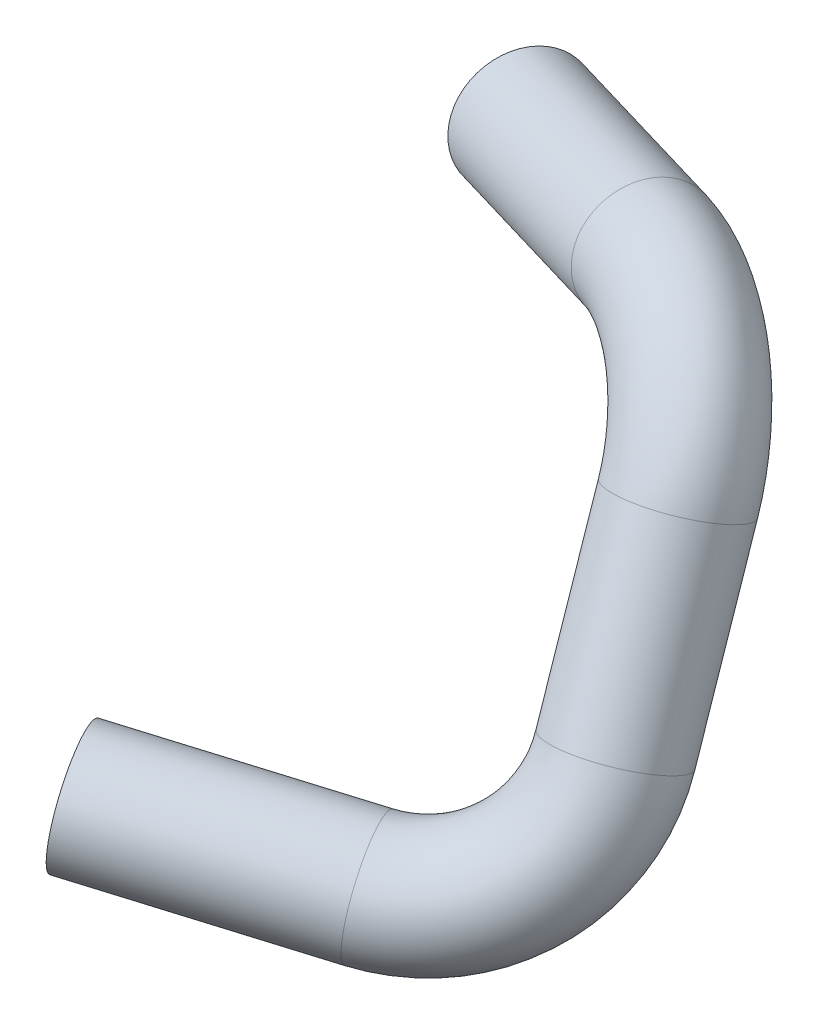
ISO-10303-21;
HEADER;
FILE_DESCRIPTION(('STEP AP214'),'2;1');
FILE_NAME('part.step','',(''),(''),'','','');
FILE_SCHEMA(('AUTOMOTIVE_DESIGN { 1 0 10303 214 1 1 1 1 }'));
ENDSEC;
DATA;
#1=APPLICATION_CONTEXT('core data for automotive mechanical design processes');
#2=APPLICATION_PROTOCOL_DEFINITION('international standard','automotive_design',2000,#1);
#3=PRODUCT_CONTEXT('',#1,'mechanical');
#4=PRODUCT('Part','Part','',(#3));
#5=PRODUCT_RELATED_PRODUCT_CATEGORY('part','',(#4));
#6=PRODUCT_DEFINITION_FORMATION('','',#4);
#7=PRODUCT_DEFINITION_CONTEXT('part definition',#1,'design');
#8=PRODUCT_DEFINITION('design','',#6,#7);
#9=PRODUCT_DEFINITION_SHAPE('','',#8);
#10=(LENGTH_UNIT() NAMED_UNIT(*) SI_UNIT(.MILLI.,.METRE.));
#11=(NAMED_UNIT(*) PLANE_ANGLE_UNIT() SI_UNIT($,.RADIAN.));
#12=(NAMED_UNIT(*) SI_UNIT($,.STERADIAN.) SOLID_ANGLE_UNIT());
#13=UNCERTAINTY_MEASURE_WITH_UNIT(LENGTH_MEASURE(1.E-05),#10,'distance_accuracy_value','');
#14=(GEOMETRIC_REPRESENTATION_CONTEXT(3) GLOBAL_UNCERTAINTY_ASSIGNED_CONTEXT((#13)) GLOBAL_UNIT_ASSIGNED_CONTEXT((#10,
#11,#12)) REPRESENTATION_CONTEXT('',''));
#15=CARTESIAN_POINT('',(0.,0.,0.));
#16=DIRECTION('',(0.,0.,1.));
#17=DIRECTION('',(1.,0.,0.));
#18=AXIS2_PLACEMENT_3D('',#15,#16,#17);
#19=CARTESIAN_POINT('',(-26.8654624841385,-1.31957880510115,27.3592431742286));
#20=DIRECTION('',(-0.884530547258439,0.135752757613117,0.446292392683453));
#21=DIRECTION('',(-0.0805243728215702,-0.986791328407361,0.140565641469493));
#22=AXIS2_PLACEMENT_3D('',#19,#20,#21);
#23=PLANE('',#22);
#24=CARTESIAN_POINT('',(-26.8654624841385,-1.31957880510115,27.3592431742286));
#25=DIRECTION('',(-0.884530547258439,0.135752757613117,0.446292392683453));
#26=DIRECTION('',(0.450462437877244,0.,0.892795380846972));
#27=AXIS2_PLACEMENT_3D('',#24,#25,#26);
#28=CIRCLE('',#27,2.325);
#29=CARTESIAN_POINT('',(-25.8181373160739,-1.31957880510115,29.4349924346978));
#30=VERTEX_POINT('',#29);
#31=EDGE_CURVE('E76',#30,#30,#28,.T.);
#32=ORIENTED_EDGE('',*,*,#31,.F.);
#33=EDGE_LOOP('',(#32));
#34=FACE_BOUND('',#33,.T.);
#35=CARTESIAN_POINT('',(-26.8654624841385,-1.31957880510115,27.3592431742286));
#36=DIRECTION('',(-0.884530547258439,0.135752757613117,0.446292392683453));
#37=DIRECTION('',(-0.0805243728215702,-0.986791328407361,0.140565641469493));
#38=AXIS2_PLACEMENT_3D('',#35,#36,#37);
#39=CIRCLE('',#38,3.175);
#40=CARTESIAN_POINT('',(-27.121127367847,-4.45264127279452,27.8055390858942));
#41=VERTEX_POINT('',#40);
#42=EDGE_CURVE('E69',#41,#41,#39,.T.);
#43=ORIENTED_EDGE('',*,*,#42,.T.);
#44=EDGE_LOOP('',(#43));
#45=FACE_BOUND('',#44,.T.);
#46=ADVANCED_FACE('F47',(#34,#45),#23,.T.);
#47=CARTESIAN_POINT('',(-28.4255457482583,16.9309418525215,1.25655118012086));
#48=DIRECTION('',(0.93420843509819,0.095346483722837,0.34374939684759));
#49=DIRECTION('',(0.345322636320624,0.,-0.938484031214476));
#50=AXIS2_PLACEMENT_3D('',#47,#48,#49);
#51=PLANE('',#50);
#52=CARTESIAN_POINT('',(-28.4255457482583,16.9309418525215,1.25655118012086));
#53=DIRECTION('',(0.93420843509819,0.095346483722837,0.34374939684759));
#54=DIRECTION('',(0.345322636320624,0.,-0.938484031214476));
#55=AXIS2_PLACEMENT_3D('',#52,#53,#54);
#56=CIRCLE('',#55,2.325);
#57=CARTESIAN_POINT('',(-27.6226706188129,16.9309418525215,-0.925424192452798));
#58=VERTEX_POINT('',#57);
#59=EDGE_CURVE('E72',#58,#58,#56,.T.);
#60=ORIENTED_EDGE('',*,*,#59,.T.);
#61=EDGE_LOOP('',(#60));
#62=FACE_BOUND('',#61,.T.);
#63=CARTESIAN_POINT('',(-28.4255457482583,16.9309418525215,1.25655118012086));
#64=DIRECTION('',(0.93420843509819,0.095346483722837,0.34374939684759));
#65=DIRECTION('',(0.345322636320624,0.,-0.938484031214476));
#66=AXIS2_PLACEMENT_3D('',#63,#64,#65);
#67=CIRCLE('',#66,3.175);
#68=CARTESIAN_POINT('',(-27.3291463779404,16.9309418525215,-1.7231356189851));
#69=VERTEX_POINT('',#68);
#70=EDGE_CURVE('E11',#69,#69,#67,.T.);
#71=ORIENTED_EDGE('',*,*,#70,.F.);
#72=EDGE_LOOP('',(#71));
#73=FACE_BOUND('',#72,.T.);
#74=ADVANCED_FACE('F123',(#62,#73),#51,.F.);
#75=CARTESIAN_POINT('',(-26.8654624841385,-1.31957880510115,27.3592431742286));
#76=DIRECTION('',(0.884530547258439,-0.135752757613117,-0.446292392683453));
#77=DIRECTION('',(-0.450462437877245,0.,-0.892795380846972));
#78=AXIS2_PLACEMENT_3D('',#75,#76,#77);
#79=CYLINDRICAL_SURFACE('',#78,3.175);
#80=ORIENTED_EDGE('',*,*,#42,.F.);
#81=EDGE_LOOP('',(#80));
#82=FACE_BOUND('',#81,.T.);
#83=CARTESIAN_POINT('',(-16.1394026733646,-2.96575394529149,21.9473793196075));
#84=DIRECTION('',(-0.884530547258439,0.135752757613118,0.446292392683453));
#85=DIRECTION('',(-0.0805243728215702,-0.986791328407361,0.140565641469493));
#86=AXIS2_PLACEMENT_3D('',#83,#84,#85);
#87=CIRCLE('',#86,3.175);
#88=CARTESIAN_POINT('',(-15.8841474239425,-5.81703162118445,23.3205819166765));
#89=VERTEX_POINT('',#88);
#90=EDGE_CURVE('E66',#89,#89,#87,.T.);
#91=ORIENTED_EDGE('',*,*,#90,.T.);
#92=EDGE_LOOP('',(#91));
#93=FACE_BOUND('',#92,.T.);
#94=ADVANCED_FACE('F119',(#82,#93),#79,.T.);
#95=CARTESIAN_POINT('',(-16.7825655065539,4.21856775774588,18.4873412797487));
#96=DIRECTION('',(0.459502228501666,0.418443502580061,0.783430109933575));
#97=DIRECTION('',(0.862577810170696,0.,-0.505924422617772));
#98=AXIS2_PLACEMENT_3D('',#95,#96,#97);
#99=TOROIDAL_SURFACE('',#98,8.,3.175);
#100=CARTESIAN_POINT('',(-9.71609049842679,3.23392667092104,14.8685828062317));
#101=DIRECTION('',(0.0928560619691799,-0.899864609431281,0.426170665870686));
#102=DIRECTION('',(0.674616118198987,-0.257941517407364,-0.691635212134054));
#103=AXIS2_PLACEMENT_3D('',#100,#101,#102);
#104=CIRCLE('',#103,3.175);
#105=CARTESIAN_POINT('',(-6.91158322957634,2.84314723958743,13.4323880370546));
#106=VERTEX_POINT('',#105);
#107=EDGE_CURVE('E61',#106,#106,#104,.T.);
#108=CARTESIAN_POINT('',(-16.7825655065539,4.21856775774588,18.4873412797487));
#109=DIRECTION('',(0.459502228501666,0.418443502580061,0.783430109933575));
#110=DIRECTION('',(0.862577810170696,0.,-0.505924422617772));
#111=AXIS2_PLACEMENT_3D('',#108,#109,#110);
#112=CIRCLE('',#111,11.175);
#113=EDGE_CURVE('',#89,#106,#112,.T.);
#114=ORIENTED_EDGE('',*,*,#90,.F.);
#115=ORIENTED_EDGE('',*,*,#107,.T.);
#116=ORIENTED_EDGE('',*,*,#113,.T.);
#117=ORIENTED_EDGE('',*,*,#113,.F.);
#118=EDGE_LOOP('',(#114,#116,#115,#117));
#119=FACE_BOUND('',#118,.T.);
#120=ADVANCED_FACE('F122',(#119),#99,.T.);
#121=CARTESIAN_POINT('',(-9.7160904984268,3.23392667092103,14.8685828062317));
#122=DIRECTION('',(-0.0928560619691802,0.899864609431281,-0.426170665870686));
#123=DIRECTION('',(0.,0.428019907604116,0.903769306125498));
#124=AXIS2_PLACEMENT_3D('',#121,#122,#123);
#125=CYLINDRICAL_SURFACE('',#124,3.175);
#126=CARTESIAN_POINT('',(-10.6694091441941,12.4725018661695,10.493247115295));
#127=DIRECTION('',(0.0928560619691802,-0.899864609431281,0.426170665870686));
#128=DIRECTION('',(0.674616118198987,-0.257941517407364,-0.691635212134054));
#129=AXIS2_PLACEMENT_3D('',#126,#127,#128);
#130=CIRCLE('',#129,3.175);
#131=CARTESIAN_POINT('',(-7.71447023785779,13.2044847789087,11.3950021126629));
#132=VERTEX_POINT('',#131);
#133=EDGE_CURVE('E57',#132,#132,#130,.T.);
#134=ORIENTED_EDGE('',*,*,#133,.T.);
#135=EDGE_LOOP('',(#134));
#136=FACE_BOUND('',#135,.T.);
#137=ORIENTED_EDGE('',*,*,#107,.F.);
#138=EDGE_LOOP('',(#137));
#139=FACE_BOUND('',#138,.T.);
#140=ADVANCED_FACE('F127',(#136,#139),#125,.T.);
#141=CARTESIAN_POINT('',(-18.1149244987422,10.6281354718661,8.22110853924988));
#142=DIRECTION('',(-0.353828993334552,0.370259799497297,0.858902045842295));
#143=DIRECTION('',(0.,-0.918307218358479,0.395868479056762));
#144=AXIS2_PLACEMENT_3D('',#141,#142,#143);
#145=TOROIDAL_SURFACE('',#144,7.99999999999999,3.175);
#146=CARTESIAN_POINT('',(-17.7518581561766,18.0203117854253,5.18401911347563));
#147=DIRECTION('',(0.93420843509819,0.095346483722837,0.34374939684759));
#148=DIRECTION('',(0.345322636320624,0.,-0.938484031214476));
#149=AXIS2_PLACEMENT_3D('',#146,#147,#148);
#150=CIRCLE('',#149,3.175);
#151=CARTESIAN_POINT('',(-17.607766201471,20.9540817598691,3.97867424762146));
#152=VERTEX_POINT('',#151);
#153=EDGE_CURVE('E53',#152,#152,#150,.T.);
#154=CARTESIAN_POINT('',(-18.1149244987422,10.6281354718661,8.22110853924988));
#155=DIRECTION('',(-0.353828993334552,0.370259799497297,0.858902045842295));
#156=DIRECTION('',(0.,-0.918307218358479,0.395868479056762));
#157=AXIS2_PLACEMENT_3D('',#154,#155,#156);
#158=CIRCLE('',#157,11.175);
#159=EDGE_CURVE('',#132,#152,#158,.T.);
#160=ORIENTED_EDGE('',*,*,#133,.F.);
#161=ORIENTED_EDGE('',*,*,#153,.T.);
#162=ORIENTED_EDGE('',*,*,#159,.T.);
#163=ORIENTED_EDGE('',*,*,#159,.F.);
#164=EDGE_LOOP('',(#160,#162,#161,#163));
#165=FACE_BOUND('',#164,.T.);
#166=ADVANCED_FACE('F105',(#165),#145,.T.);
#167=CARTESIAN_POINT('',(-17.7518581561766,18.0203117854253,5.18401911347564));
#168=DIRECTION('',(-0.93420843509819,-0.0953464837228373,-0.34374939684759));
#169=DIRECTION('',(-0.345322636320624,0.,0.938484031214476));
#170=AXIS2_PLACEMENT_3D('',#167,#168,#169);
#171=CYLINDRICAL_SURFACE('',#170,3.175);
#172=ORIENTED_EDGE('',*,*,#70,.T.);
#173=EDGE_LOOP('',(#172));
#174=FACE_BOUND('',#173,.T.);
#175=ORIENTED_EDGE('',*,*,#153,.F.);
#176=EDGE_LOOP('',(#175));
#177=FACE_BOUND('',#176,.T.);
#178=ADVANCED_FACE('F95',(#174,#177),#171,.T.);
#179=CARTESIAN_POINT('',(-26.8654624841385,-1.31957880510115,27.3592431742286));
#180=DIRECTION('',(0.884530547258439,-0.135752757613117,-0.446292392683453));
#181=DIRECTION('',(-0.450462437877245,0.,-0.892795380846972));
#182=AXIS2_PLACEMENT_3D('',#179,#180,#181);
#183=CYLINDRICAL_SURFACE('',#182,2.325);
#184=ORIENTED_EDGE('',*,*,#31,.T.);
#185=EDGE_LOOP('',(#184));
#186=FACE_BOUND('',#185,.T.);
#187=CARTESIAN_POINT('',(-16.1394026733646,-2.96575394529149,21.9473793196075));
#188=DIRECTION('',(0.884530547258439,-0.135752757613118,-0.446292392683453));
#189=DIRECTION('',(-0.450462437877244,0.,-0.892795380846972));
#190=AXIS2_PLACEMENT_3D('',#187,#188,#189);
#191=CIRCLE('',#190,2.325);
#192=CARTESIAN_POINT('',(-15.9524834749689,-5.05369744023673,22.9529528749415));
#193=VERTEX_POINT('',#192);
#194=EDGE_CURVE('E79',#193,#193,#191,.F.);
#195=ORIENTED_EDGE('',*,*,#194,.F.);
#196=EDGE_LOOP('',(#195));
#197=FACE_BOUND('',#196,.T.);
#198=ADVANCED_FACE('F93',(#186,#197),#183,.F.);
#199=CARTESIAN_POINT('',(-16.7825655065539,4.21856775774588,18.4873412797487));
#200=DIRECTION('',(0.459502228501666,0.418443502580061,0.783430109933575));
#201=DIRECTION('',(0.862577810170696,0.,-0.505924422617772));
#202=AXIS2_PLACEMENT_3D('',#199,#200,#201);
#203=TOROIDAL_SURFACE('',#202,8.,2.325);
#204=CARTESIAN_POINT('',(-9.71609049842679,3.23392667092103,14.8685828062317));
#205=DIRECTION('',(0.09285606196918,-0.899864609431281,0.426170665870686));
#206=DIRECTION('',(0.,-0.428019907604116,-0.903769306125498));
#207=AXIS2_PLACEMENT_3D('',#204,#205,#206);
#208=CIRCLE('',#207,2.325);
#209=CARTESIAN_POINT('',(-7.66239619918985,2.94776535506256,13.8168811248658));
#210=VERTEX_POINT('',#209);
#211=EDGE_CURVE('E85',#210,#210,#208,.T.);
#212=CARTESIAN_POINT('',(-16.7825655065539,4.21856775774588,18.4873412797487));
#213=DIRECTION('',(0.459502228501666,0.418443502580061,0.783430109933575));
#214=DIRECTION('',(0.862577810170696,0.,-0.505924422617772));
#215=AXIS2_PLACEMENT_3D('',#212,#213,#214);
#216=CIRCLE('',#215,10.325);
#217=EDGE_CURVE('',#193,#210,#216,.T.);
#218=ORIENTED_EDGE('',*,*,#194,.T.);
#219=ORIENTED_EDGE('',*,*,#211,.F.);
#220=ORIENTED_EDGE('',*,*,#217,.T.);
#221=ORIENTED_EDGE('',*,*,#217,.F.);
#222=EDGE_LOOP('',(#218,#220,#219,#221));
#223=FACE_BOUND('',#222,.T.);
#224=ADVANCED_FACE('F91',(#223),#203,.F.);
#225=CARTESIAN_POINT('',(-9.7160904984268,3.23392667092103,14.8685828062317));
#226=DIRECTION('',(-0.0928560619691802,0.899864609431281,-0.426170665870686));
#227=DIRECTION('',(0.,0.428019907604116,0.903769306125498));
#228=AXIS2_PLACEMENT_3D('',#225,#226,#227);
#229=CYLINDRICAL_SURFACE('',#228,2.325);
#230=CARTESIAN_POINT('',(-10.6694091441941,12.4725018661695,10.493247115295));
#231=DIRECTION('',(-0.0928560619691802,0.899864609431281,-0.426170665870686));
#232=DIRECTION('',(0.,0.428019907604116,0.903769306125498));
#233=AXIS2_PLACEMENT_3D('',#230,#231,#232);
#234=CIRCLE('',#233,2.325);
#235=CARTESIAN_POINT('',(-8.50555624427852,13.0085208495139,11.1535873889581));
#236=VERTEX_POINT('',#235);
#237=EDGE_CURVE('E82',#236,#236,#234,.F.);
#238=ORIENTED_EDGE('',*,*,#237,.F.);
#239=EDGE_LOOP('',(#238));
#240=FACE_BOUND('',#239,.T.);
#241=ORIENTED_EDGE('',*,*,#211,.T.);
#242=EDGE_LOOP('',(#241));
#243=FACE_BOUND('',#242,.T.);
#244=ADVANCED_FACE('F102',(#240,#243),#229,.F.);
#245=CARTESIAN_POINT('',(-18.1149244987422,10.6281354718661,8.22110853924988));
#246=DIRECTION('',(-0.353828993334552,0.370259799497297,0.858902045842295));
#247=DIRECTION('',(0.,-0.918307218358479,0.395868479056762));
#248=AXIS2_PLACEMENT_3D('',#245,#246,#247);
#249=TOROIDAL_SURFACE('',#248,7.99999999999999,2.325);
#250=CARTESIAN_POINT('',(-17.7518581561767,18.0203117854253,5.18401911347563));
#251=DIRECTION('',(0.93420843509819,0.0953464837228389,0.343749396847589));
#252=DIRECTION('',(0.345322636320622,0.,-0.938484031214477));
#253=AXIS2_PLACEMENT_3D('',#250,#251,#252);
#254=CIRCLE('',#253,2.325);
#255=CARTESIAN_POINT('',(-17.6463420003686,20.1686630265535,4.30136499910999));
#256=VERTEX_POINT('',#255);
#257=EDGE_CURVE('E75',#256,#256,#254,.T.);
#258=CARTESIAN_POINT('',(-18.1149244987422,10.6281354718661,8.22110853924988));
#259=DIRECTION('',(-0.353828993334552,0.370259799497297,0.858902045842295));
#260=DIRECTION('',(0.,-0.918307218358479,0.395868479056762));
#261=AXIS2_PLACEMENT_3D('',#258,#259,#260);
#262=CIRCLE('',#261,10.325);
#263=EDGE_CURVE('',#236,#256,#262,.T.);
#264=ORIENTED_EDGE('',*,*,#237,.T.);
#265=ORIENTED_EDGE('',*,*,#257,.F.);
#266=ORIENTED_EDGE('',*,*,#263,.T.);
#267=ORIENTED_EDGE('',*,*,#263,.F.);
#268=EDGE_LOOP('',(#264,#266,#265,#267));
#269=FACE_BOUND('',#268,.T.);
#270=ADVANCED_FACE('F110',(#269),#249,.F.);
#271=CARTESIAN_POINT('',(-17.7518581561766,18.0203117854253,5.18401911347564));
#272=DIRECTION('',(-0.93420843509819,-0.0953464837228373,-0.34374939684759));
#273=DIRECTION('',(-0.345322636320624,0.,0.938484031214476));
#274=AXIS2_PLACEMENT_3D('',#271,#272,#273);
#275=CYLINDRICAL_SURFACE('',#274,2.325);
#276=ORIENTED_EDGE('',*,*,#59,.F.);
#277=EDGE_LOOP('',(#276));
#278=FACE_BOUND('',#277,.T.);
#279=ORIENTED_EDGE('',*,*,#257,.T.);
#280=EDGE_LOOP('',(#279));
#281=FACE_BOUND('',#280,.T.);
#282=ADVANCED_FACE('F114',(#278,#281),#275,.F.);
#283=CLOSED_SHELL('',(#46,#74,#94,#120,#140,#166,#178,#198,#224,#244,#270,#282));
#284=MANIFOLD_SOLID_BREP('B2',#283);
#285=ADVANCED_BREP_SHAPE_REPRESENTATION('',(#18,#284),#14);
#286=SHAPE_DEFINITION_REPRESENTATION(#9,#285);
ENDSEC;
END-ISO-10303-21;
